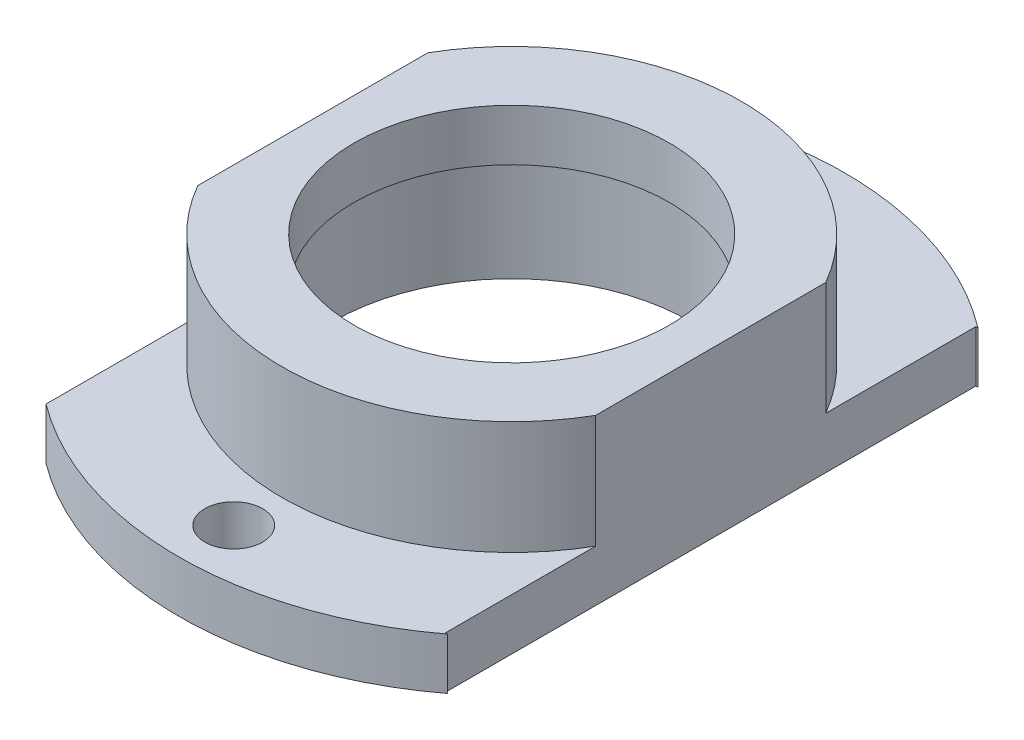
ISO-10303-21;
HEADER;
FILE_DESCRIPTION(('STEP AP214'),'2;1');
FILE_NAME('part.step','',(''),(''),'','','');
FILE_SCHEMA(('AUTOMOTIVE_DESIGN { 1 0 10303 214 1 1 1 1 }'));
ENDSEC;
DATA;
#1=APPLICATION_CONTEXT('core data for automotive mechanical design processes');
#2=APPLICATION_PROTOCOL_DEFINITION('international standard','automotive_design',2000,#1);
#3=PRODUCT_CONTEXT('',#1,'mechanical');
#4=PRODUCT('Part','Part','',(#3));
#5=PRODUCT_RELATED_PRODUCT_CATEGORY('part','',(#4));
#6=PRODUCT_DEFINITION_FORMATION('','',#4);
#7=PRODUCT_DEFINITION_CONTEXT('part definition',#1,'design');
#8=PRODUCT_DEFINITION('design','',#6,#7);
#9=PRODUCT_DEFINITION_SHAPE('','',#8);
#10=(LENGTH_UNIT() NAMED_UNIT(*) SI_UNIT(.MILLI.,.METRE.));
#11=(NAMED_UNIT(*) PLANE_ANGLE_UNIT() SI_UNIT($,.RADIAN.));
#12=(NAMED_UNIT(*) SI_UNIT($,.STERADIAN.) SOLID_ANGLE_UNIT());
#13=UNCERTAINTY_MEASURE_WITH_UNIT(LENGTH_MEASURE(1.E-05),#10,'distance_accuracy_value','');
#14=(GEOMETRIC_REPRESENTATION_CONTEXT(3) GLOBAL_UNCERTAINTY_ASSIGNED_CONTEXT((#13)) GLOBAL_UNIT_ASSIGNED_CONTEXT((#10,
#11,#12)) REPRESENTATION_CONTEXT('',''));
#15=CARTESIAN_POINT('',(0.,0.,0.));
#16=DIRECTION('',(0.,0.,1.));
#17=DIRECTION('',(1.,0.,0.));
#18=AXIS2_PLACEMENT_3D('',#15,#16,#17);
#19=CARTESIAN_POINT('',(0.,0.,0.));
#20=DIRECTION('',(0.,1.,0.));
#21=DIRECTION('',(-1.,0.,0.));
#22=AXIS2_PLACEMENT_3D('',#19,#20,#21);
#23=PLANE('',#22);
#24=CARTESIAN_POINT('',(-10.9982,0.,-17.145));
#25=DIRECTION('',(0.,1.,0.));
#26=DIRECTION('',(-1.,0.,0.));
#27=AXIS2_PLACEMENT_3D('',#24,#25,#26);
#28=CIRCLE('',#27,1.78593749999999);
#29=CARTESIAN_POINT('',(-12.7841375,0.,-17.145));
#30=VERTEX_POINT('',#29);
#31=EDGE_CURVE('E209',#30,#30,#28,.F.);
#32=ORIENTED_EDGE('',*,*,#31,.F.);
#33=EDGE_LOOP('',(#32));
#34=FACE_BOUND('',#33,.T.);
#35=CARTESIAN_POINT('',(-10.9982,0.,17.145));
#36=DIRECTION('',(0.,1.,0.));
#37=DIRECTION('',(-1.,0.,0.));
#38=AXIS2_PLACEMENT_3D('',#35,#36,#37);
#39=CIRCLE('',#38,1.7859375);
#40=CARTESIAN_POINT('',(-12.7841375,0.,17.145));
#41=VERTEX_POINT('',#40);
#42=EDGE_CURVE('E207',#41,#41,#39,.F.);
#43=ORIENTED_EDGE('',*,*,#42,.F.);
#44=EDGE_LOOP('',(#43));
#45=FACE_BOUND('',#44,.T.);
#46=CARTESIAN_POINT('',(-10.9982,0.,0.));
#47=DIRECTION('',(0.,1.,0.));
#48=DIRECTION('',(-1.,0.,0.));
#49=AXIS2_PLACEMENT_3D('',#46,#47,#48);
#50=CIRCLE('',#49,10.9982);
#51=CARTESIAN_POINT('',(-21.9964,0.,0.));
#52=VERTEX_POINT('',#51);
#53=EDGE_CURVE('E184',#52,#52,#50,.T.);
#54=ORIENTED_EDGE('',*,*,#53,.T.);
#55=EDGE_LOOP('',(#54));
#56=FACE_BOUND('',#55,.T.);
#57=DIRECTION('',(0.,0.,-1.));
#58=VECTOR('',#57,1.);
#59=CARTESIAN_POINT('',(-23.2664,0.,-17.1684544927204));
#60=LINE('',#59,#58);
#61=CARTESIAN_POINT('',(-23.2664,0.,16.452750742657));
#62=VERTEX_POINT('',#61);
#63=CARTESIAN_POINT('',(-23.2664,0.,-16.452750742657));
#64=VERTEX_POINT('',#63);
#65=EDGE_CURVE('E140',#62,#64,#60,.T.);
#66=ORIENTED_EDGE('',*,*,#65,.T.);
#67=CARTESIAN_POINT('',(-10.9982,0.,0.));
#68=DIRECTION('',(0.,1.,0.));
#69=DIRECTION('',(-1.,0.,0.));
#70=AXIS2_PLACEMENT_3D('',#67,#68,#69);
#71=CIRCLE('',#70,20.5232);
#72=CARTESIAN_POINT('',(1.4035788637855,0.,-16.3522970635248));
#73=VERTEX_POINT('',#72);
#74=EDGE_CURVE('E181',#73,#64,#71,.T.);
#75=ORIENTED_EDGE('',*,*,#74,.F.);
#76=DIRECTION('',(1.,0.,0.));
#77=VECTOR('',#76,1.);
#78=CARTESIAN_POINT('',(17.6966785608101,0.,-16.3522970635248));
#79=LINE('',#78,#77);
#80=CARTESIAN_POINT('',(1.27,0.,-16.3522970635248));
#81=VERTEX_POINT('',#80);
#82=EDGE_CURVE('E123',#81,#73,#79,.T.);
#83=ORIENTED_EDGE('',*,*,#82,.F.);
#84=DIRECTION('',(0.,0.,-1.));
#85=VECTOR('',#84,1.);
#86=CARTESIAN_POINT('',(1.27,0.,-16.3522970635248));
#87=LINE('',#86,#85);
#88=CARTESIAN_POINT('',(1.27,0.,16.3522970635248));
#89=VERTEX_POINT('',#88);
#90=EDGE_CURVE('E122',#89,#81,#87,.T.);
#91=ORIENTED_EDGE('',*,*,#90,.F.);
#92=DIRECTION('',(1.,0.,0.));
#93=VECTOR('',#92,1.);
#94=CARTESIAN_POINT('',(17.6966785608101,0.,16.3522970635248));
#95=LINE('',#94,#93);
#96=CARTESIAN_POINT('',(1.4035788637855,0.,16.3522970635248));
#97=VERTEX_POINT('',#96);
#98=EDGE_CURVE('E111',#89,#97,#95,.T.);
#99=ORIENTED_EDGE('',*,*,#98,.T.);
#100=EDGE_CURVE('E182',#62,#97,#71,.T.);
#101=ORIENTED_EDGE('',*,*,#100,.F.);
#102=EDGE_LOOP('',(#66,#75,#83,#91,#99,#101));
#103=FACE_BOUND('',#102,.T.);
#104=ADVANCED_FACE('F35',(#34,#45,#56,#103),#23,.F.);
#105=CARTESIAN_POINT('',(-10.9982,23.0744138665793,0.));
#106=DIRECTION('',(0.,1.,0.));
#107=DIRECTION('',(-1.,0.,0.));
#108=AXIS2_PLACEMENT_3D('',#105,#106,#107);
#109=CYLINDRICAL_SURFACE('',#108,20.5232);
#110=DIRECTION('',(0.,1.,0.));
#111=VECTOR('',#110,1.);
#112=CARTESIAN_POINT('',(-23.2664,23.0744138665793,16.452750742657));
#113=LINE('',#112,#111);
#114=CARTESIAN_POINT('',(-23.2664,3.175,16.452750742657));
#115=VERTEX_POINT('',#114);
#116=EDGE_CURVE('E154',#62,#115,#113,.T.);
#117=ORIENTED_EDGE('',*,*,#116,.F.);
#118=ORIENTED_EDGE('',*,*,#100,.T.);
#119=DIRECTION('',(0.,1.,0.));
#120=VECTOR('',#119,1.);
#121=CARTESIAN_POINT('',(1.40357886378549,23.0744138665793,16.3522970635248));
#122=LINE('',#121,#120);
#123=CARTESIAN_POINT('',(1.4035788637855,3.175,16.3522970635248));
#124=VERTEX_POINT('',#123);
#125=EDGE_CURVE('E117',#124,#97,#122,.F.);
#126=ORIENTED_EDGE('',*,*,#125,.F.);
#127=CARTESIAN_POINT('',(-10.9982,3.175,0.));
#128=DIRECTION('',(0.,1.,0.));
#129=DIRECTION('',(-1.,0.,0.));
#130=AXIS2_PLACEMENT_3D('',#127,#128,#129);
#131=CIRCLE('',#130,20.5232);
#132=EDGE_CURVE('E178',#115,#124,#131,.T.);
#133=ORIENTED_EDGE('',*,*,#132,.F.);
#134=EDGE_LOOP('',(#117,#118,#126,#133));
#135=FACE_BOUND('',#134,.T.);
#136=ADVANCED_FACE('F228',(#135),#109,.T.);
#137=DIRECTION('',(0.,1.,0.));
#138=VECTOR('',#137,1.);
#139=CARTESIAN_POINT('',(-23.2664,23.0744138665793,-16.452750742657));
#140=LINE('',#139,#138);
#141=CARTESIAN_POINT('',(-23.2664,3.175,-16.452750742657));
#142=VERTEX_POINT('',#141);
#143=EDGE_CURVE('E150',#142,#64,#140,.F.);
#144=ORIENTED_EDGE('',*,*,#143,.F.);
#145=CARTESIAN_POINT('',(1.4035788637855,3.175,-16.3522970635248));
#146=VERTEX_POINT('',#145);
#147=EDGE_CURVE('E177',#146,#142,#131,.T.);
#148=ORIENTED_EDGE('',*,*,#147,.F.);
#149=DIRECTION('',(0.,1.,0.));
#150=VECTOR('',#149,1.);
#151=CARTESIAN_POINT('',(1.40357886378549,23.0744138665793,-16.3522970635248));
#152=LINE('',#151,#150);
#153=EDGE_CURVE('E156',#146,#73,#152,.F.);
#154=ORIENTED_EDGE('',*,*,#153,.T.);
#155=ORIENTED_EDGE('',*,*,#74,.T.);
#156=EDGE_LOOP('',(#144,#148,#154,#155));
#157=FACE_BOUND('',#156,.T.);
#158=ADVANCED_FACE('F200',(#157),#109,.T.);
#159=CARTESIAN_POINT('',(9.525,3.175,0.));
#160=DIRECTION('',(0.,-1.,0.));
#161=DIRECTION('',(1.,0.,0.));
#162=AXIS2_PLACEMENT_3D('',#159,#160,#161);
#163=PLANE('',#162);
#164=CARTESIAN_POINT('',(-10.9982,3.175,17.145));
#165=DIRECTION('',(0.,1.,0.));
#166=DIRECTION('',(-1.,0.,0.));
#167=AXIS2_PLACEMENT_3D('',#164,#165,#166);
#168=CIRCLE('',#167,1.7859375);
#169=CARTESIAN_POINT('',(-12.7841375,3.175,17.145));
#170=VERTEX_POINT('',#169);
#171=EDGE_CURVE('E217',#170,#170,#168,.T.);
#172=ORIENTED_EDGE('',*,*,#171,.F.);
#173=EDGE_LOOP('',(#172));
#174=FACE_BOUND('',#173,.T.);
#175=DIRECTION('',(0.,0.,-1.));
#176=VECTOR('',#175,1.);
#177=CARTESIAN_POINT('',(-23.2664,3.175,0.));
#178=LINE('',#177,#176);
#179=CARTESIAN_POINT('',(-23.2664,3.175,7.09724361988513));
#180=VERTEX_POINT('',#179);
#181=EDGE_CURVE('E151',#115,#180,#178,.T.);
#182=ORIENTED_EDGE('',*,*,#181,.F.);
#183=ORIENTED_EDGE('',*,*,#132,.T.);
#184=DIRECTION('',(1.,0.,0.));
#185=VECTOR('',#184,1.);
#186=CARTESIAN_POINT('',(9.525,3.175,16.3522970635248));
#187=LINE('',#186,#185);
#188=CARTESIAN_POINT('',(1.27,3.175,16.3522970635248));
#189=VERTEX_POINT('',#188);
#190=EDGE_CURVE('E11',#189,#124,#187,.T.);
#191=ORIENTED_EDGE('',*,*,#190,.F.);
#192=DIRECTION('',(0.,0.,-1.));
#193=VECTOR('',#192,1.);
#194=CARTESIAN_POINT('',(1.27,3.175,0.));
#195=LINE('',#194,#193);
#196=CARTESIAN_POINT('',(1.27,3.175,7.09724361988512));
#197=VERTEX_POINT('',#196);
#198=EDGE_CURVE('E129',#189,#197,#195,.T.);
#199=ORIENTED_EDGE('',*,*,#198,.T.);
#200=CARTESIAN_POINT('',(-10.9982,3.175,0.));
#201=DIRECTION('',(0.,1.,0.));
#202=DIRECTION('',(-1.,0.,0.));
#203=AXIS2_PLACEMENT_3D('',#200,#201,#202);
#204=CIRCLE('',#203,14.1732);
#205=EDGE_CURVE('E174',#180,#197,#204,.T.);
#206=ORIENTED_EDGE('',*,*,#205,.F.);
#207=EDGE_LOOP('',(#182,#183,#191,#199,#206));
#208=FACE_BOUND('',#207,.T.);
#209=ADVANCED_FACE('F262',(#174,#208),#163,.F.);
#210=CARTESIAN_POINT('',(-10.9982,3.175,-17.145));
#211=DIRECTION('',(0.,1.,0.));
#212=DIRECTION('',(-1.,0.,0.));
#213=AXIS2_PLACEMENT_3D('',#210,#211,#212);
#214=CIRCLE('',#213,1.78593749999999);
#215=CARTESIAN_POINT('',(-12.7841375,3.175,-17.145));
#216=VERTEX_POINT('',#215);
#217=EDGE_CURVE('E211',#216,#216,#214,.T.);
#218=ORIENTED_EDGE('',*,*,#217,.F.);
#219=EDGE_LOOP('',(#218));
#220=FACE_BOUND('',#219,.T.);
#221=CARTESIAN_POINT('',(-23.2664,3.175,-7.09724361988513));
#222=VERTEX_POINT('',#221);
#223=EDGE_CURVE('E148',#222,#142,#178,.T.);
#224=ORIENTED_EDGE('',*,*,#223,.F.);
#225=CARTESIAN_POINT('',(1.27,3.175,-7.09724361988512));
#226=VERTEX_POINT('',#225);
#227=EDGE_CURVE('E173',#226,#222,#204,.T.);
#228=ORIENTED_EDGE('',*,*,#227,.F.);
#229=CARTESIAN_POINT('',(1.27,3.175,-16.3522970635248));
#230=VERTEX_POINT('',#229);
#231=EDGE_CURVE('E139',#226,#230,#195,.T.);
#232=ORIENTED_EDGE('',*,*,#231,.T.);
#233=DIRECTION('',(1.,0.,0.));
#234=VECTOR('',#233,1.);
#235=CARTESIAN_POINT('',(9.525,3.175,-16.3522970635248));
#236=LINE('',#235,#234);
#237=EDGE_CURVE('E43',#230,#146,#236,.T.);
#238=ORIENTED_EDGE('',*,*,#237,.T.);
#239=ORIENTED_EDGE('',*,*,#147,.T.);
#240=EDGE_LOOP('',(#224,#228,#232,#238,#239));
#241=FACE_BOUND('',#240,.T.);
#242=ADVANCED_FACE('F195',(#220,#241),#163,.F.);
#243=CARTESIAN_POINT('',(-10.9982,23.0744138665793,0.));
#244=DIRECTION('',(0.,1.,0.));
#245=DIRECTION('',(-1.,0.,0.));
#246=AXIS2_PLACEMENT_3D('',#243,#244,#245);
#247=CYLINDRICAL_SURFACE('',#246,14.1732);
#248=DIRECTION('',(0.,1.,0.));
#249=VECTOR('',#248,1.);
#250=CARTESIAN_POINT('',(-23.2664,23.0744138665793,7.09724361988513));
#251=LINE('',#250,#249);
#252=CARTESIAN_POINT('',(-23.2664,10.16,7.09724361988512));
#253=VERTEX_POINT('',#252);
#254=EDGE_CURVE('E58',#180,#253,#251,.T.);
#255=ORIENTED_EDGE('',*,*,#254,.F.);
#256=ORIENTED_EDGE('',*,*,#205,.T.);
#257=DIRECTION('',(0.,1.,0.));
#258=VECTOR('',#257,1.);
#259=CARTESIAN_POINT('',(1.27,23.0744138665793,7.09724361988512));
#260=LINE('',#259,#258);
#261=CARTESIAN_POINT('',(1.27,10.16,7.09724361988512));
#262=VERTEX_POINT('',#261);
#263=EDGE_CURVE('E143',#197,#262,#260,.T.);
#264=ORIENTED_EDGE('',*,*,#263,.T.);
#265=CARTESIAN_POINT('',(-10.9982,10.16,0.));
#266=DIRECTION('',(0.,1.,0.));
#267=DIRECTION('',(-1.,0.,0.));
#268=AXIS2_PLACEMENT_3D('',#265,#266,#267);
#269=CIRCLE('',#268,14.1732);
#270=EDGE_CURVE('E170',#253,#262,#269,.T.);
#271=ORIENTED_EDGE('',*,*,#270,.F.);
#272=EDGE_LOOP('',(#255,#256,#264,#271));
#273=FACE_BOUND('',#272,.T.);
#274=ADVANCED_FACE('F258',(#273),#247,.T.);
#275=DIRECTION('',(0.,1.,0.));
#276=VECTOR('',#275,1.);
#277=CARTESIAN_POINT('',(-23.2664,23.0744138665793,-7.09724361988513));
#278=LINE('',#277,#276);
#279=CARTESIAN_POINT('',(-23.2664,10.16,-7.09724361988513));
#280=VERTEX_POINT('',#279);
#281=EDGE_CURVE('E146',#280,#222,#278,.F.);
#282=ORIENTED_EDGE('',*,*,#281,.F.);
#283=CARTESIAN_POINT('',(1.27,10.16,-7.09724361988512));
#284=VERTEX_POINT('',#283);
#285=EDGE_CURVE('E169',#284,#280,#269,.T.);
#286=ORIENTED_EDGE('',*,*,#285,.F.);
#287=DIRECTION('',(0.,1.,0.));
#288=VECTOR('',#287,1.);
#289=CARTESIAN_POINT('',(1.27,23.0744138665793,-7.09724361988512));
#290=LINE('',#289,#288);
#291=EDGE_CURVE('E50',#284,#226,#290,.F.);
#292=ORIENTED_EDGE('',*,*,#291,.T.);
#293=ORIENTED_EDGE('',*,*,#227,.T.);
#294=EDGE_LOOP('',(#282,#286,#292,#293));
#295=FACE_BOUND('',#294,.T.);
#296=ADVANCED_FACE('F251',(#295),#247,.T.);
#297=CARTESIAN_POINT('',(3.175,10.16,0.));
#298=DIRECTION('',(0.,-1.,0.));
#299=DIRECTION('',(1.,0.,0.));
#300=AXIS2_PLACEMENT_3D('',#297,#298,#299);
#301=PLANE('',#300);
#302=CARTESIAN_POINT('',(-10.9982,10.16,0.));
#303=DIRECTION('',(0.,1.,0.));
#304=DIRECTION('',(-1.,0.,0.));
#305=AXIS2_PLACEMENT_3D('',#302,#303,#304);
#306=CIRCLE('',#305,9.7282);
#307=CARTESIAN_POINT('',(-20.7264,10.16,0.));
#308=VERTEX_POINT('',#307);
#309=EDGE_CURVE('E166',#308,#308,#306,.T.);
#310=ORIENTED_EDGE('',*,*,#309,.F.);
#311=EDGE_LOOP('',(#310));
#312=FACE_BOUND('',#311,.T.);
#313=DIRECTION('',(0.,0.,-1.));
#314=VECTOR('',#313,1.);
#315=CARTESIAN_POINT('',(-23.2664,10.16,0.));
#316=LINE('',#315,#314);
#317=EDGE_CURVE('E189',#253,#280,#316,.T.);
#318=ORIENTED_EDGE('',*,*,#317,.F.);
#319=ORIENTED_EDGE('',*,*,#270,.T.);
#320=DIRECTION('',(0.,0.,-1.));
#321=VECTOR('',#320,1.);
#322=CARTESIAN_POINT('',(1.27,10.16,0.));
#323=LINE('',#322,#321);
#324=EDGE_CURVE('E187',#262,#284,#323,.T.);
#325=ORIENTED_EDGE('',*,*,#324,.T.);
#326=ORIENTED_EDGE('',*,*,#285,.T.);
#327=EDGE_LOOP('',(#318,#319,#325,#326));
#328=FACE_BOUND('',#327,.T.);
#329=ADVANCED_FACE('F235',(#312,#328),#301,.F.);
#330=CARTESIAN_POINT('',(-10.9982,23.0744138665793,0.));
#331=DIRECTION('',(0.,1.,0.));
#332=DIRECTION('',(-1.,0.,0.));
#333=AXIS2_PLACEMENT_3D('',#330,#331,#332);
#334=CYLINDRICAL_SURFACE('',#333,10.9982);
#335=ORIENTED_EDGE('',*,*,#53,.F.);
#336=EDGE_LOOP('',(#335));
#337=FACE_BOUND('',#336,.T.);
#338=CARTESIAN_POINT('',(-10.9982,6.985,0.));
#339=DIRECTION('',(0.,1.,0.));
#340=DIRECTION('',(-1.,0.,0.));
#341=AXIS2_PLACEMENT_3D('',#338,#339,#340);
#342=CIRCLE('',#341,10.9982);
#343=CARTESIAN_POINT('',(-21.9964,6.985,0.));
#344=VERTEX_POINT('',#343);
#345=EDGE_CURVE('E160',#344,#344,#342,.T.);
#346=ORIENTED_EDGE('',*,*,#345,.T.);
#347=EDGE_LOOP('',(#346));
#348=FACE_BOUND('',#347,.T.);
#349=ADVANCED_FACE('F37',(#337,#348),#334,.F.);
#350=CARTESIAN_POINT('',(-10.9982,23.0744138665793,0.));
#351=DIRECTION('',(0.,1.,0.));
#352=DIRECTION('',(-1.,0.,0.));
#353=AXIS2_PLACEMENT_3D('',#350,#351,#352);
#354=CYLINDRICAL_SURFACE('',#353,9.7282);
#355=CARTESIAN_POINT('',(-10.9982,6.985,0.));
#356=DIRECTION('',(0.,1.,0.));
#357=DIRECTION('',(-1.,0.,0.));
#358=AXIS2_PLACEMENT_3D('',#355,#356,#357);
#359=CIRCLE('',#358,9.7282);
#360=CARTESIAN_POINT('',(-20.7264,6.985,0.));
#361=VERTEX_POINT('',#360);
#362=EDGE_CURVE('E163',#361,#361,#359,.T.);
#363=ORIENTED_EDGE('',*,*,#362,.F.);
#364=EDGE_LOOP('',(#363));
#365=FACE_BOUND('',#364,.T.);
#366=ORIENTED_EDGE('',*,*,#309,.T.);
#367=EDGE_LOOP('',(#366));
#368=FACE_BOUND('',#367,.T.);
#369=ADVANCED_FACE('F234',(#365,#368),#354,.F.);
#370=CARTESIAN_POINT('',(-1.27,6.985,0.));
#371=DIRECTION('',(0.,1.,0.));
#372=DIRECTION('',(-1.,0.,0.));
#373=AXIS2_PLACEMENT_3D('',#370,#371,#372);
#374=PLANE('',#373);
#375=ORIENTED_EDGE('',*,*,#345,.F.);
#376=EDGE_LOOP('',(#375));
#377=FACE_BOUND('',#376,.T.);
#378=ORIENTED_EDGE('',*,*,#362,.T.);
#379=EDGE_LOOP('',(#378));
#380=FACE_BOUND('',#379,.T.);
#381=ADVANCED_FACE('F238',(#377,#380),#374,.F.);
#382=CARTESIAN_POINT('',(17.6966785608102,-36.5981727078721,16.3522970635248));
#383=DIRECTION('',(0.,0.,-1.));
#384=DIRECTION('',(-1.,0.,0.));
#385=AXIS2_PLACEMENT_3D('',#382,#383,#384);
#386=PLANE('',#385);
#387=ORIENTED_EDGE('',*,*,#125,.T.);
#388=ORIENTED_EDGE('',*,*,#98,.F.);
#389=DIRECTION('',(0.,1.,0.));
#390=VECTOR('',#389,1.);
#391=CARTESIAN_POINT('',(1.27000000000001,-36.5981727078721,16.3522970635248));
#392=LINE('',#391,#390);
#393=EDGE_CURVE('E114',#89,#189,#392,.T.);
#394=ORIENTED_EDGE('',*,*,#393,.T.);
#395=ORIENTED_EDGE('',*,*,#190,.T.);
#396=EDGE_LOOP('',(#387,#388,#394,#395));
#397=FACE_BOUND('',#396,.T.);
#398=ADVANCED_FACE('F113',(#397),#386,.T.);
#399=CARTESIAN_POINT('',(17.6966785608102,-36.5981727078721,-16.3522970635248));
#400=DIRECTION('',(0.,0.,-1.));
#401=DIRECTION('',(-1.,0.,0.));
#402=AXIS2_PLACEMENT_3D('',#399,#400,#401);
#403=PLANE('',#402);
#404=ORIENTED_EDGE('',*,*,#237,.F.);
#405=DIRECTION('',(0.,1.,0.));
#406=VECTOR('',#405,1.);
#407=CARTESIAN_POINT('',(1.27000000000001,-36.5981727078721,-16.3522970635248));
#408=LINE('',#407,#406);
#409=EDGE_CURVE('E130',#81,#230,#408,.T.);
#410=ORIENTED_EDGE('',*,*,#409,.F.);
#411=ORIENTED_EDGE('',*,*,#82,.T.);
#412=ORIENTED_EDGE('',*,*,#153,.F.);
#413=EDGE_LOOP('',(#404,#410,#411,#412));
#414=FACE_BOUND('',#413,.T.);
#415=ADVANCED_FACE('F276',(#414),#403,.F.);
#416=CARTESIAN_POINT('',(1.27000000000001,-36.5981727078721,-16.3522970635248));
#417=DIRECTION('',(-1.,0.,0.));
#418=DIRECTION('',(0.,-1.,0.));
#419=AXIS2_PLACEMENT_3D('',#416,#417,#418);
#420=PLANE('',#419);
#421=ORIENTED_EDGE('',*,*,#393,.F.);
#422=ORIENTED_EDGE('',*,*,#90,.T.);
#423=ORIENTED_EDGE('',*,*,#409,.T.);
#424=ORIENTED_EDGE('',*,*,#231,.F.);
#425=ORIENTED_EDGE('',*,*,#291,.F.);
#426=ORIENTED_EDGE('',*,*,#324,.F.);
#427=ORIENTED_EDGE('',*,*,#263,.F.);
#428=ORIENTED_EDGE('',*,*,#198,.F.);
#429=EDGE_LOOP('',(#421,#422,#423,#424,#425,#426,#427,#428));
#430=FACE_BOUND('',#429,.T.);
#431=ADVANCED_FACE('F125',(#430),#420,.F.);
#432=CARTESIAN_POINT('',(-23.2664,-36.5981727078721,-17.1684544927204));
#433=DIRECTION('',(-1.,0.,0.));
#434=DIRECTION('',(0.,-1.,0.));
#435=AXIS2_PLACEMENT_3D('',#432,#433,#434);
#436=PLANE('',#435);
#437=ORIENTED_EDGE('',*,*,#116,.T.);
#438=ORIENTED_EDGE('',*,*,#181,.T.);
#439=ORIENTED_EDGE('',*,*,#254,.T.);
#440=ORIENTED_EDGE('',*,*,#317,.T.);
#441=ORIENTED_EDGE('',*,*,#281,.T.);
#442=ORIENTED_EDGE('',*,*,#223,.T.);
#443=ORIENTED_EDGE('',*,*,#143,.T.);
#444=ORIENTED_EDGE('',*,*,#65,.F.);
#445=EDGE_LOOP('',(#437,#438,#439,#440,#441,#442,#443,#444));
#446=FACE_BOUND('',#445,.T.);
#447=ADVANCED_FACE('F202',(#446),#436,.T.);
#448=CARTESIAN_POINT('',(-10.9982,-0.0010000000000062,-17.145));
#449=DIRECTION('',(0.,1.,0.));
#450=DIRECTION('',(-1.,0.,0.));
#451=AXIS2_PLACEMENT_3D('',#448,#449,#450);
#452=CYLINDRICAL_SURFACE('',#451,1.78593749999999);
#453=ORIENTED_EDGE('',*,*,#217,.T.);
#454=EDGE_LOOP('',(#453));
#455=FACE_BOUND('',#454,.T.);
#456=ORIENTED_EDGE('',*,*,#31,.T.);
#457=EDGE_LOOP('',(#456));
#458=FACE_BOUND('',#457,.T.);
#459=ADVANCED_FACE('F285',(#455,#458),#452,.F.);
#460=CARTESIAN_POINT('',(-10.9982,-0.0010000000000062,17.145));
#461=DIRECTION('',(0.,1.,0.));
#462=DIRECTION('',(-1.,0.,0.));
#463=AXIS2_PLACEMENT_3D('',#460,#461,#462);
#464=CYLINDRICAL_SURFACE('',#463,1.7859375);
#465=ORIENTED_EDGE('',*,*,#171,.T.);
#466=EDGE_LOOP('',(#465));
#467=FACE_BOUND('',#466,.T.);
#468=ORIENTED_EDGE('',*,*,#42,.T.);
#469=EDGE_LOOP('',(#468));
#470=FACE_BOUND('',#469,.T.);
#471=ADVANCED_FACE('F224',(#467,#470),#464,.F.);
#472=CLOSED_SHELL('',(#104,#136,#158,#209,#242,#274,#296,#329,#349,#369,#381,#398,#415,#431,
#447,#459,#471));
#473=MANIFOLD_SOLID_BREP('B2',#472);
#474=ADVANCED_BREP_SHAPE_REPRESENTATION('',(#18,#473),#14);
#475=SHAPE_DEFINITION_REPRESENTATION(#9,#474);
ENDSEC;
END-ISO-10303-21;
